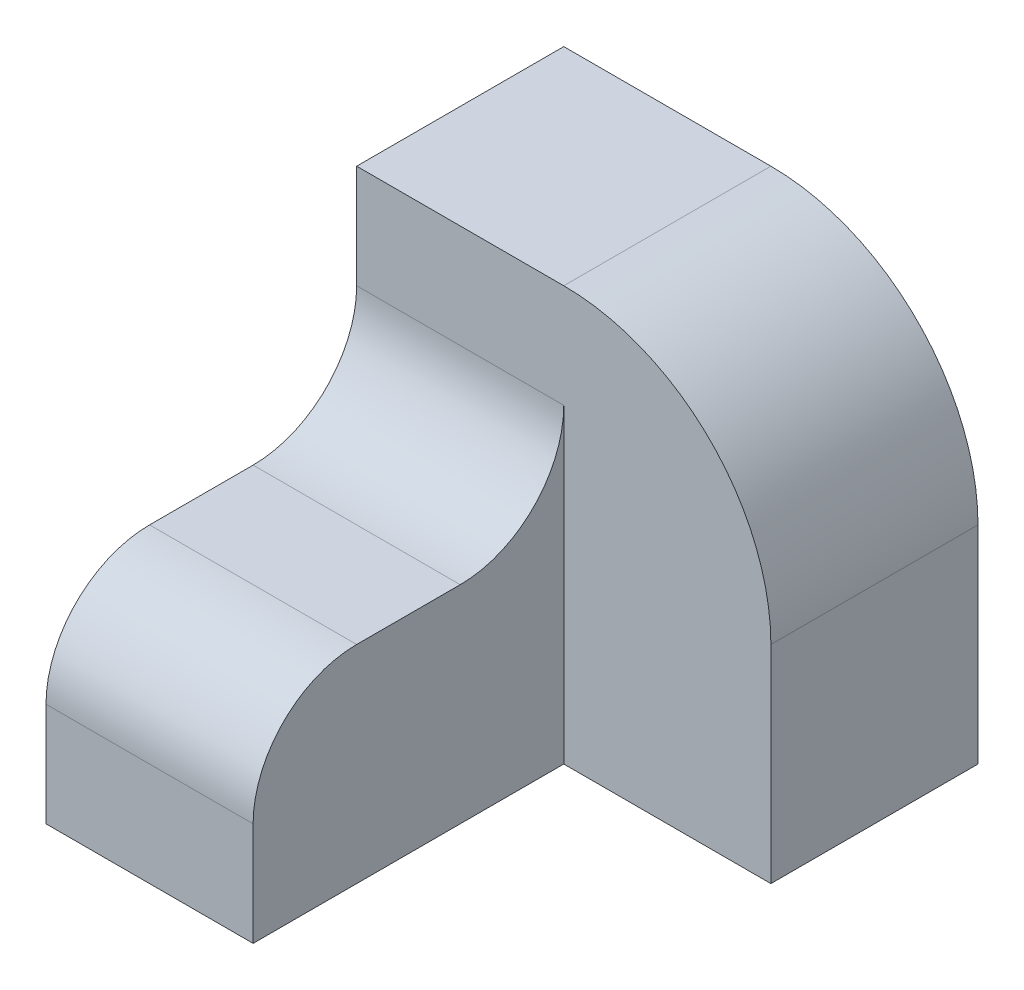
ISO-10303-21;
HEADER;
FILE_DESCRIPTION(('STEP AP214'),'2;1');
FILE_NAME('part.step','',(''),(''),'','','');
FILE_SCHEMA(('AUTOMOTIVE_DESIGN { 1 0 10303 214 1 1 1 1 }'));
ENDSEC;
DATA;
#1=APPLICATION_CONTEXT('core data for automotive mechanical design processes');
#2=APPLICATION_PROTOCOL_DEFINITION('international standard','automotive_design',2000,#1);
#3=PRODUCT_CONTEXT('',#1,'mechanical');
#4=PRODUCT('Part','Part','',(#3));
#5=PRODUCT_RELATED_PRODUCT_CATEGORY('part','',(#4));
#6=PRODUCT_DEFINITION_FORMATION('','',#4);
#7=PRODUCT_DEFINITION_CONTEXT('part definition',#1,'design');
#8=PRODUCT_DEFINITION('design','',#6,#7);
#9=PRODUCT_DEFINITION_SHAPE('','',#8);
#10=(LENGTH_UNIT() NAMED_UNIT(*) SI_UNIT(.MILLI.,.METRE.));
#11=(NAMED_UNIT(*) PLANE_ANGLE_UNIT() SI_UNIT($,.RADIAN.));
#12=(NAMED_UNIT(*) SI_UNIT($,.STERADIAN.) SOLID_ANGLE_UNIT());
#13=UNCERTAINTY_MEASURE_WITH_UNIT(LENGTH_MEASURE(1.E-05),#10,'distance_accuracy_value','');
#14=(GEOMETRIC_REPRESENTATION_CONTEXT(3) GLOBAL_UNCERTAINTY_ASSIGNED_CONTEXT((#13)) GLOBAL_UNIT_ASSIGNED_CONTEXT((#10,
#11,#12)) REPRESENTATION_CONTEXT('',''));
#15=CARTESIAN_POINT('',(0.,0.,0.));
#16=DIRECTION('',(0.,0.,1.));
#17=DIRECTION('',(1.,0.,0.));
#18=AXIS2_PLACEMENT_3D('',#15,#16,#17);
#19=CARTESIAN_POINT('',(0.,40.,0.));
#20=DIRECTION('',(1.,0.,0.));
#21=DIRECTION('',(0.,0.,-1.));
#22=AXIS2_PLACEMENT_3D('',#19,#20,#21);
#23=PLANE('',#22);
#24=DIRECTION('',(0.,-1.,0.));
#25=VECTOR('',#24,1.);
#26=CARTESIAN_POINT('',(0.,40.,-20.));
#27=LINE('',#26,#25);
#28=CARTESIAN_POINT('',(0.,20.,-20.));
#29=VERTEX_POINT('',#28);
#30=CARTESIAN_POINT('',(0.,0.,-20.));
#31=VERTEX_POINT('',#30);
#32=EDGE_CURVE('E164',#29,#31,#27,.T.);
#33=ORIENTED_EDGE('',*,*,#32,.F.);
#34=DIRECTION('',(0.,0.,1.));
#35=VECTOR('',#34,1.);
#36=CARTESIAN_POINT('',(0.,20.,0.));
#37=LINE('',#36,#35);
#38=CARTESIAN_POINT('',(0.,20.,0.));
#39=VERTEX_POINT('',#38);
#40=EDGE_CURVE('E183',#29,#39,#37,.T.);
#41=ORIENTED_EDGE('',*,*,#40,.T.);
#42=DIRECTION('',(0.,-1.,0.));
#43=VECTOR('',#42,1.);
#44=CARTESIAN_POINT('',(0.,40.,0.));
#45=LINE('',#44,#43);
#46=CARTESIAN_POINT('',(0.,0.,0.));
#47=VERTEX_POINT('',#46);
#48=EDGE_CURVE('E155',#39,#47,#45,.T.);
#49=ORIENTED_EDGE('',*,*,#48,.T.);
#50=DIRECTION('',(0.,0.,1.));
#51=VECTOR('',#50,1.);
#52=CARTESIAN_POINT('',(0.,0.,0.));
#53=LINE('',#52,#51);
#54=EDGE_CURVE('E120',#31,#47,#53,.T.);
#55=ORIENTED_EDGE('',*,*,#54,.F.);
#56=EDGE_LOOP('',(#33,#41,#49,#55));
#57=FACE_BOUND('',#56,.T.);
#58=ADVANCED_FACE('F33',(#57),#23,.T.);
#59=CARTESIAN_POINT('',(0.,40.,-20.));
#60=DIRECTION('',(0.,0.,-1.));
#61=DIRECTION('',(-1.,0.,0.));
#62=AXIS2_PLACEMENT_3D('',#59,#60,#61);
#63=PLANE('',#62);
#64=DIRECTION('',(1.,0.,0.));
#65=VECTOR('',#64,1.);
#66=CARTESIAN_POINT('',(0.,40.,-20.));
#67=LINE('',#66,#65);
#68=CARTESIAN_POINT('',(-40.,40.,-20.));
#69=VERTEX_POINT('',#68);
#70=CARTESIAN_POINT('',(-20.,40.,-20.));
#71=VERTEX_POINT('',#70);
#72=EDGE_CURVE('E149',#69,#71,#67,.T.);
#73=ORIENTED_EDGE('',*,*,#72,.T.);
#74=CARTESIAN_POINT('',(-20.,20.,-20.));
#75=DIRECTION('',(0.,0.,-1.));
#76=DIRECTION('',(-1.,0.,0.));
#77=AXIS2_PLACEMENT_3D('',#74,#75,#76);
#78=CIRCLE('',#77,20.);
#79=EDGE_CURVE('E11',#71,#29,#78,.T.);
#80=ORIENTED_EDGE('',*,*,#79,.T.);
#81=ORIENTED_EDGE('',*,*,#32,.T.);
#82=DIRECTION('',(1.,0.,0.));
#83=VECTOR('',#82,1.);
#84=CARTESIAN_POINT('',(0.,0.,-20.));
#85=LINE('',#84,#83);
#86=CARTESIAN_POINT('',(-40.,0.,-20.));
#87=VERTEX_POINT('',#86);
#88=EDGE_CURVE('E132',#87,#31,#85,.T.);
#89=ORIENTED_EDGE('',*,*,#88,.F.);
#90=DIRECTION('',(0.,-1.,0.));
#91=VECTOR('',#90,1.);
#92=CARTESIAN_POINT('',(-40.,40.,-20.));
#93=LINE('',#92,#91);
#94=EDGE_CURVE('E127',#69,#87,#93,.T.);
#95=ORIENTED_EDGE('',*,*,#94,.F.);
#96=EDGE_LOOP('',(#73,#80,#81,#89,#95));
#97=FACE_BOUND('',#96,.T.);
#98=ADVANCED_FACE('F195',(#97),#63,.T.);
#99=CARTESIAN_POINT('',(-40.,40.,0.));
#100=DIRECTION('',(-1.,0.,0.));
#101=DIRECTION('',(0.,0.,1.));
#102=AXIS2_PLACEMENT_3D('',#99,#100,#101);
#103=PLANE('',#102);
#104=DIRECTION('',(0.,-1.,0.));
#105=VECTOR('',#104,1.);
#106=CARTESIAN_POINT('',(-40.,20.,30.));
#107=LINE('',#106,#105);
#108=CARTESIAN_POINT('',(-40.,10.,30.));
#109=VERTEX_POINT('',#108);
#110=CARTESIAN_POINT('',(-40.,0.,30.));
#111=VERTEX_POINT('',#110);
#112=EDGE_CURVE('E110',#109,#111,#107,.T.);
#113=ORIENTED_EDGE('',*,*,#112,.F.);
#114=CARTESIAN_POINT('',(-40.,10.,20.));
#115=DIRECTION('',(-1.,0.,0.));
#116=DIRECTION('',(0.,0.,1.));
#117=AXIS2_PLACEMENT_3D('',#114,#115,#116);
#118=CIRCLE('',#117,10.);
#119=CARTESIAN_POINT('',(-40.,20.,20.));
#120=VERTEX_POINT('',#119);
#121=EDGE_CURVE('E175',#109,#120,#118,.T.);
#122=ORIENTED_EDGE('',*,*,#121,.T.);
#123=DIRECTION('',(0.,0.,-1.));
#124=VECTOR('',#123,1.);
#125=CARTESIAN_POINT('',(-40.,20.,0.));
#126=LINE('',#125,#124);
#127=CARTESIAN_POINT('',(-40.,20.,10.));
#128=VERTEX_POINT('',#127);
#129=EDGE_CURVE('E139',#120,#128,#126,.T.);
#130=ORIENTED_EDGE('',*,*,#129,.T.);
#131=CARTESIAN_POINT('',(-40.,30.,10.));
#132=DIRECTION('',(-1.,0.,0.));
#133=DIRECTION('',(0.,0.,1.));
#134=AXIS2_PLACEMENT_3D('',#131,#132,#133);
#135=CIRCLE('',#134,10.);
#136=CARTESIAN_POINT('',(-40.,30.,0.));
#137=VERTEX_POINT('',#136);
#138=EDGE_CURVE('E179',#128,#137,#135,.F.);
#139=ORIENTED_EDGE('',*,*,#138,.T.);
#140=DIRECTION('',(0.,-1.,0.));
#141=VECTOR('',#140,1.);
#142=CARTESIAN_POINT('',(-40.,40.,0.));
#143=LINE('',#142,#141);
#144=CARTESIAN_POINT('',(-40.,40.,0.));
#145=VERTEX_POINT('',#144);
#146=EDGE_CURVE('E160',#145,#137,#143,.T.);
#147=ORIENTED_EDGE('',*,*,#146,.F.);
#148=DIRECTION('',(0.,0.,-1.));
#149=VECTOR('',#148,1.);
#150=CARTESIAN_POINT('',(-40.,40.,0.));
#151=LINE('',#150,#149);
#152=EDGE_CURVE('E151',#145,#69,#151,.T.);
#153=ORIENTED_EDGE('',*,*,#152,.T.);
#154=ORIENTED_EDGE('',*,*,#94,.T.);
#155=DIRECTION('',(0.,0.,-1.));
#156=VECTOR('',#155,1.);
#157=CARTESIAN_POINT('',(-40.,0.,0.));
#158=LINE('',#157,#156);
#159=EDGE_CURVE('E124',#111,#87,#158,.T.);
#160=ORIENTED_EDGE('',*,*,#159,.F.);
#161=EDGE_LOOP('',(#113,#122,#130,#139,#147,#153,#154,#160));
#162=FACE_BOUND('',#161,.T.);
#163=ADVANCED_FACE('F125',(#162),#103,.T.);
#164=CARTESIAN_POINT('',(0.,40.,0.));
#165=DIRECTION('',(0.,0.,1.));
#166=DIRECTION('',(1.,0.,0.));
#167=AXIS2_PLACEMENT_3D('',#164,#165,#166);
#168=PLANE('',#167);
#169=ORIENTED_EDGE('',*,*,#48,.F.);
#170=CARTESIAN_POINT('',(-20.,20.,0.));
#171=DIRECTION('',(0.,0.,1.));
#172=DIRECTION('',(1.,0.,0.));
#173=AXIS2_PLACEMENT_3D('',#170,#171,#172);
#174=CIRCLE('',#173,20.);
#175=CARTESIAN_POINT('',(-20.,40.,0.));
#176=VERTEX_POINT('',#175);
#177=EDGE_CURVE('E55',#39,#176,#174,.T.);
#178=ORIENTED_EDGE('',*,*,#177,.T.);
#179=DIRECTION('',(-1.,0.,0.));
#180=VECTOR('',#179,1.);
#181=CARTESIAN_POINT('',(0.,40.,0.));
#182=LINE('',#181,#180);
#183=EDGE_CURVE('E153',#176,#145,#182,.T.);
#184=ORIENTED_EDGE('',*,*,#183,.T.);
#185=ORIENTED_EDGE('',*,*,#146,.T.);
#186=DIRECTION('',(-1.,0.,0.));
#187=VECTOR('',#186,1.);
#188=CARTESIAN_POINT('',(-20.,30.,0.));
#189=LINE('',#188,#187);
#190=CARTESIAN_POINT('',(-20.,30.,0.));
#191=VERTEX_POINT('',#190);
#192=EDGE_CURVE('E171',#137,#191,#189,.F.);
#193=ORIENTED_EDGE('',*,*,#192,.T.);
#194=DIRECTION('',(0.,-1.,0.));
#195=VECTOR('',#194,1.);
#196=CARTESIAN_POINT('',(-20.,20.,0.));
#197=LINE('',#196,#195);
#198=CARTESIAN_POINT('',(-20.,0.,0.));
#199=VERTEX_POINT('',#198);
#200=EDGE_CURVE('E145',#191,#199,#197,.T.);
#201=ORIENTED_EDGE('',*,*,#200,.T.);
#202=DIRECTION('',(-1.,0.,0.));
#203=VECTOR('',#202,1.);
#204=CARTESIAN_POINT('',(0.,0.,0.));
#205=LINE('',#204,#203);
#206=EDGE_CURVE('E131',#47,#199,#205,.T.);
#207=ORIENTED_EDGE('',*,*,#206,.F.);
#208=EDGE_LOOP('',(#169,#178,#184,#185,#193,#201,#207));
#209=FACE_BOUND('',#208,.T.);
#210=ADVANCED_FACE('F193',(#209),#168,.T.);
#211=CARTESIAN_POINT('',(0.,40.,0.));
#212=DIRECTION('',(0.,1.,0.));
#213=DIRECTION('',(0.,0.,1.));
#214=AXIS2_PLACEMENT_3D('',#211,#212,#213);
#215=PLANE('',#214);
#216=ORIENTED_EDGE('',*,*,#183,.F.);
#217=DIRECTION('',(0.,0.,1.));
#218=VECTOR('',#217,1.);
#219=CARTESIAN_POINT('',(-20.,40.,0.));
#220=LINE('',#219,#218);
#221=EDGE_CURVE('E41',#176,#71,#220,.F.);
#222=ORIENTED_EDGE('',*,*,#221,.T.);
#223=ORIENTED_EDGE('',*,*,#72,.F.);
#224=ORIENTED_EDGE('',*,*,#152,.F.);
#225=EDGE_LOOP('',(#216,#222,#223,#224));
#226=FACE_BOUND('',#225,.T.);
#227=ADVANCED_FACE('F232',(#226),#215,.T.);
#228=CARTESIAN_POINT('',(0.,0.,0.));
#229=DIRECTION('',(0.,1.,0.));
#230=DIRECTION('',(0.,0.,1.));
#231=AXIS2_PLACEMENT_3D('',#228,#229,#230);
#232=PLANE('',#231);
#233=ORIENTED_EDGE('',*,*,#54,.T.);
#234=ORIENTED_EDGE('',*,*,#206,.T.);
#235=DIRECTION('',(0.,0.,1.));
#236=VECTOR('',#235,1.);
#237=CARTESIAN_POINT('',(-20.,0.,0.));
#238=LINE('',#237,#236);
#239=CARTESIAN_POINT('',(-20.,0.,30.));
#240=VERTEX_POINT('',#239);
#241=EDGE_CURVE('E137',#199,#240,#238,.T.);
#242=ORIENTED_EDGE('',*,*,#241,.T.);
#243=DIRECTION('',(-1.,0.,0.));
#244=VECTOR('',#243,1.);
#245=CARTESIAN_POINT('',(0.,0.,30.));
#246=LINE('',#245,#244);
#247=EDGE_CURVE('E115',#240,#111,#246,.T.);
#248=ORIENTED_EDGE('',*,*,#247,.T.);
#249=ORIENTED_EDGE('',*,*,#159,.T.);
#250=ORIENTED_EDGE('',*,*,#88,.T.);
#251=EDGE_LOOP('',(#233,#234,#242,#248,#249,#250));
#252=FACE_BOUND('',#251,.T.);
#253=ADVANCED_FACE('F135',(#252),#232,.F.);
#254=CARTESIAN_POINT('',(0.,20.,30.));
#255=DIRECTION('',(0.,0.,1.));
#256=DIRECTION('',(1.,0.,0.));
#257=AXIS2_PLACEMENT_3D('',#254,#255,#256);
#258=PLANE('',#257);
#259=DIRECTION('',(0.,-1.,0.));
#260=VECTOR('',#259,1.);
#261=CARTESIAN_POINT('',(-20.,20.,30.));
#262=LINE('',#261,#260);
#263=CARTESIAN_POINT('',(-20.,10.,30.));
#264=VERTEX_POINT('',#263);
#265=EDGE_CURVE('E121',#264,#240,#262,.T.);
#266=ORIENTED_EDGE('',*,*,#265,.F.);
#267=DIRECTION('',(-1.,0.,0.));
#268=VECTOR('',#267,1.);
#269=CARTESIAN_POINT('',(0.,10.,30.));
#270=LINE('',#269,#268);
#271=EDGE_CURVE('E118',#264,#109,#270,.T.);
#272=ORIENTED_EDGE('',*,*,#271,.T.);
#273=ORIENTED_EDGE('',*,*,#112,.T.);
#274=ORIENTED_EDGE('',*,*,#247,.F.);
#275=EDGE_LOOP('',(#266,#272,#273,#274));
#276=FACE_BOUND('',#275,.T.);
#277=ADVANCED_FACE('F113',(#276),#258,.T.);
#278=CARTESIAN_POINT('',(-20.,20.,0.));
#279=DIRECTION('',(1.,0.,0.));
#280=DIRECTION('',(0.,0.,-1.));
#281=AXIS2_PLACEMENT_3D('',#278,#279,#280);
#282=PLANE('',#281);
#283=DIRECTION('',(0.,0.,1.));
#284=VECTOR('',#283,1.);
#285=CARTESIAN_POINT('',(-20.,20.,0.));
#286=LINE('',#285,#284);
#287=CARTESIAN_POINT('',(-20.,20.,10.));
#288=VERTEX_POINT('',#287);
#289=CARTESIAN_POINT('',(-20.,20.,20.));
#290=VERTEX_POINT('',#289);
#291=EDGE_CURVE('E142',#288,#290,#286,.T.);
#292=ORIENTED_EDGE('',*,*,#291,.T.);
#293=CARTESIAN_POINT('',(-20.,10.,20.));
#294=DIRECTION('',(1.,0.,0.));
#295=DIRECTION('',(0.,0.,-1.));
#296=AXIS2_PLACEMENT_3D('',#293,#294,#295);
#297=CIRCLE('',#296,10.);
#298=EDGE_CURVE('E177',#290,#264,#297,.T.);
#299=ORIENTED_EDGE('',*,*,#298,.T.);
#300=ORIENTED_EDGE('',*,*,#265,.T.);
#301=ORIENTED_EDGE('',*,*,#241,.F.);
#302=ORIENTED_EDGE('',*,*,#200,.F.);
#303=CARTESIAN_POINT('',(-20.,30.,10.));
#304=DIRECTION('',(1.,0.,0.));
#305=DIRECTION('',(0.,0.,-1.));
#306=AXIS2_PLACEMENT_3D('',#303,#304,#305);
#307=CIRCLE('',#306,10.);
#308=EDGE_CURVE('E181',#191,#288,#307,.F.);
#309=ORIENTED_EDGE('',*,*,#308,.T.);
#310=EDGE_LOOP('',(#292,#299,#300,#301,#302,#309));
#311=FACE_BOUND('',#310,.T.);
#312=ADVANCED_FACE('F217',(#311),#282,.T.);
#313=CARTESIAN_POINT('',(0.,20.,0.));
#314=DIRECTION('',(0.,1.,0.));
#315=DIRECTION('',(0.,0.,1.));
#316=AXIS2_PLACEMENT_3D('',#313,#314,#315);
#317=PLANE('',#316);
#318=ORIENTED_EDGE('',*,*,#291,.F.);
#319=DIRECTION('',(-1.,0.,0.));
#320=VECTOR('',#319,1.);
#321=CARTESIAN_POINT('',(-40.,20.,10.));
#322=LINE('',#321,#320);
#323=EDGE_CURVE('E168',#288,#128,#322,.T.);
#324=ORIENTED_EDGE('',*,*,#323,.T.);
#325=ORIENTED_EDGE('',*,*,#129,.F.);
#326=DIRECTION('',(-1.,0.,0.));
#327=VECTOR('',#326,1.);
#328=CARTESIAN_POINT('',(0.,20.,20.));
#329=LINE('',#328,#327);
#330=EDGE_CURVE('E166',#120,#290,#329,.F.);
#331=ORIENTED_EDGE('',*,*,#330,.T.);
#332=EDGE_LOOP('',(#318,#324,#325,#331));
#333=FACE_BOUND('',#332,.T.);
#334=ADVANCED_FACE('F212',(#333),#317,.T.);
#335=CARTESIAN_POINT('',(0.,30.,10.));
#336=DIRECTION('',(1.,0.,0.));
#337=DIRECTION('',(0.,0.,-1.));
#338=AXIS2_PLACEMENT_3D('',#335,#336,#337);
#339=CYLINDRICAL_SURFACE('',#338,10.);
#340=ORIENTED_EDGE('',*,*,#308,.F.);
#341=ORIENTED_EDGE('',*,*,#192,.F.);
#342=ORIENTED_EDGE('',*,*,#138,.F.);
#343=ORIENTED_EDGE('',*,*,#323,.F.);
#344=EDGE_LOOP('',(#340,#341,#342,#343));
#345=FACE_BOUND('',#344,.T.);
#346=ADVANCED_FACE('F201',(#345),#339,.F.);
#347=CARTESIAN_POINT('',(0.,10.,20.));
#348=DIRECTION('',(-1.,0.,0.));
#349=DIRECTION('',(0.,0.,1.));
#350=AXIS2_PLACEMENT_3D('',#347,#348,#349);
#351=CYLINDRICAL_SURFACE('',#350,10.);
#352=ORIENTED_EDGE('',*,*,#298,.F.);
#353=ORIENTED_EDGE('',*,*,#330,.F.);
#354=ORIENTED_EDGE('',*,*,#121,.F.);
#355=ORIENTED_EDGE('',*,*,#271,.F.);
#356=EDGE_LOOP('',(#352,#353,#354,#355));
#357=FACE_BOUND('',#356,.T.);
#358=ADVANCED_FACE('F197',(#357),#351,.T.);
#359=CARTESIAN_POINT('',(-20.,20.,0.));
#360=DIRECTION('',(0.,0.,1.));
#361=DIRECTION('',(1.,0.,0.));
#362=AXIS2_PLACEMENT_3D('',#359,#360,#361);
#363=CYLINDRICAL_SURFACE('',#362,20.);
#364=ORIENTED_EDGE('',*,*,#79,.F.);
#365=ORIENTED_EDGE('',*,*,#221,.F.);
#366=ORIENTED_EDGE('',*,*,#177,.F.);
#367=ORIENTED_EDGE('',*,*,#40,.F.);
#368=EDGE_LOOP('',(#364,#365,#366,#367));
#369=FACE_BOUND('',#368,.T.);
#370=ADVANCED_FACE('F35',(#369),#363,.T.);
#371=CLOSED_SHELL('',(#58,#98,#163,#210,#227,#253,#277,#312,#334,#346,#358,#370));
#372=MANIFOLD_SOLID_BREP('B2',#371);
#373=ADVANCED_BREP_SHAPE_REPRESENTATION('',(#18,#372),#14);
#374=SHAPE_DEFINITION_REPRESENTATION(#9,#373);
ENDSEC;
END-ISO-10303-21;
